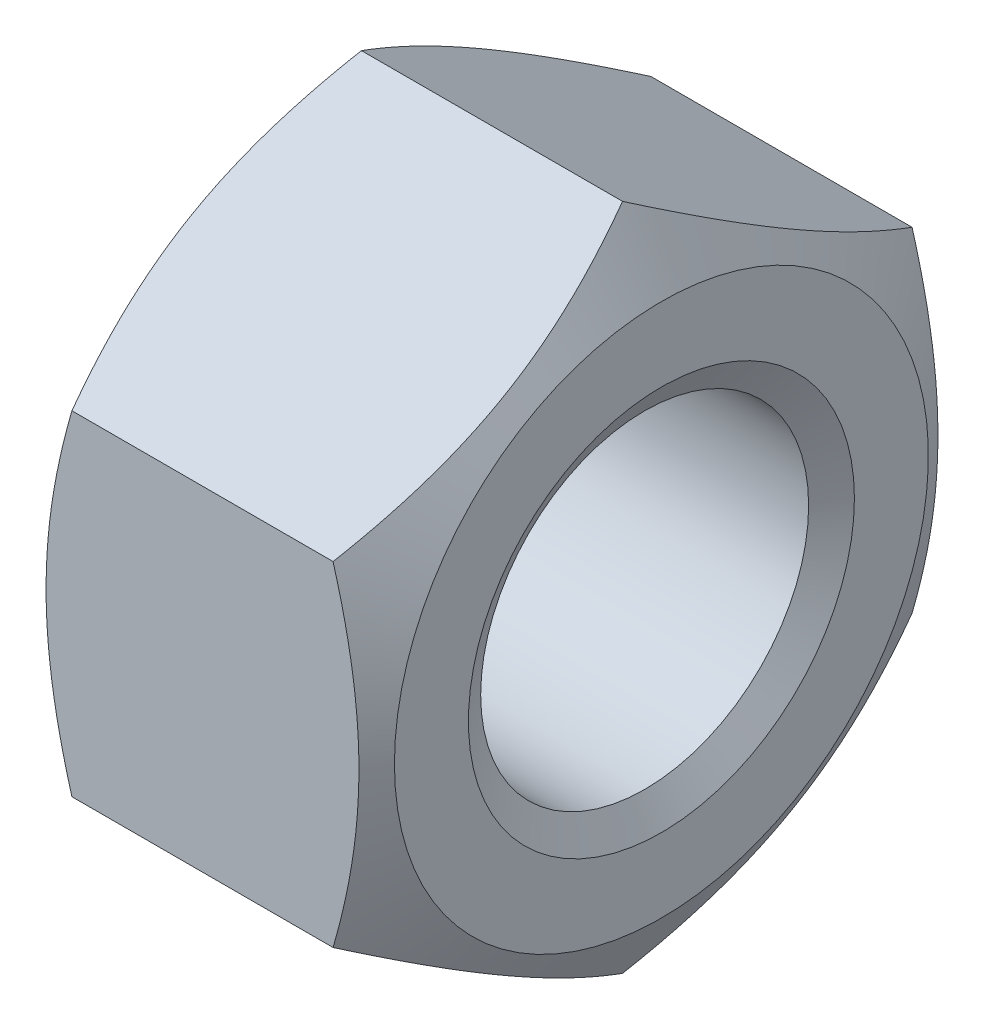
ISO-10303-21;
HEADER;
FILE_DESCRIPTION(('STEP AP214'),'2;1');
FILE_NAME('part.step','',(''),(''),'','','');
FILE_SCHEMA(('AUTOMOTIVE_DESIGN { 1 0 10303 214 1 1 1 1 }'));
ENDSEC;
DATA;
#1=APPLICATION_CONTEXT('core data for automotive mechanical design processes');
#2=APPLICATION_PROTOCOL_DEFINITION('international standard','automotive_design',2000,#1);
#3=PRODUCT_CONTEXT('',#1,'mechanical');
#4=PRODUCT('Part','Part','',(#3));
#5=PRODUCT_RELATED_PRODUCT_CATEGORY('part','',(#4));
#6=PRODUCT_DEFINITION_FORMATION('','',#4);
#7=PRODUCT_DEFINITION_CONTEXT('part definition',#1,'design');
#8=PRODUCT_DEFINITION('design','',#6,#7);
#9=PRODUCT_DEFINITION_SHAPE('','',#8);
#10=(LENGTH_UNIT() NAMED_UNIT(*) SI_UNIT(.MILLI.,.METRE.));
#11=(NAMED_UNIT(*) PLANE_ANGLE_UNIT() SI_UNIT($,.RADIAN.));
#12=(NAMED_UNIT(*) SI_UNIT($,.STERADIAN.) SOLID_ANGLE_UNIT());
#13=UNCERTAINTY_MEASURE_WITH_UNIT(LENGTH_MEASURE(1.E-05),#10,'distance_accuracy_value','');
#14=(GEOMETRIC_REPRESENTATION_CONTEXT(3) GLOBAL_UNCERTAINTY_ASSIGNED_CONTEXT((#13)) GLOBAL_UNIT_ASSIGNED_CONTEXT((#10,
#11,#12)) REPRESENTATION_CONTEXT('',''));
#15=CARTESIAN_POINT('',(0.,0.,0.));
#16=DIRECTION('',(0.,0.,1.));
#17=DIRECTION('',(1.,0.,0.));
#18=AXIS2_PLACEMENT_3D('',#15,#16,#17);
#19=CARTESIAN_POINT('',(0.,-7.79422863405995,13.5));
#20=DIRECTION('',(0.,0.,1.));
#21=DIRECTION('',(1.,0.,0.));
#22=AXIS2_PLACEMENT_3D('',#19,#20,#21);
#23=PLANE('',#22);
#24=CARTESIAN_POINT('',(13.9880108170991,7.79422866024235,13.4999999629604));
#25=CARTESIAN_POINT('',(14.0869101067593,7.45160224952271,13.4999999866953));
#26=CARTESIAN_POINT('',(14.1813213508545,7.10763941052336,13.4999999964342));
#27=CARTESIAN_POINT('',(14.3599202672367,6.41695557527496,13.5000000035669));
#28=CARTESIAN_POINT('',(14.4441045770286,6.07023371159992,13.5000000009567));
#29=CARTESIAN_POINT('',(14.6011179835783,5.37336182789301,13.499999999041));
#30=CARTESIAN_POINT('',(14.6739202156594,5.02320571029543,13.4999999997433));
#31=CARTESIAN_POINT('',(14.8066061822784,4.32046037851166,13.5000000002567));
#32=CARTESIAN_POINT('',(14.8664906537927,3.96787130431411,13.500000000068));
#33=CARTESIAN_POINT('',(14.9707940384127,3.26929452818138,13.4999999999337));
#34=CARTESIAN_POINT('',(15.0155581871121,2.92335868569997,13.4999999999822));
#35=CARTESIAN_POINT('',(15.0906168963567,2.22990195665751,13.5000000000178));
#36=CARTESIAN_POINT('',(15.1209111783586,1.88238103971397,13.5000000000048));
#37=CARTESIAN_POINT('',(15.166265243494,1.1867555101566,13.4999999999952));
#38=CARTESIAN_POINT('',(15.181343128927,0.838652085767659,13.4999999999987));
#39=CARTESIAN_POINT('',(15.1959401460983,0.142124020372473,13.5000000000013));
#40=CARTESIAN_POINT('',(15.1954597586715,-0.206300610373957,13.5000000000003));
#41=CARTESIAN_POINT('',(15.180027703548,-0.857664265109713,13.4999999999997));
#42=CARTESIAN_POINT('',(15.1669583745284,-1.16064973519983,13.4999999999999));
#43=CARTESIAN_POINT('',(15.1293010846734,-1.76592371877752,13.5000000000001));
#44=CARTESIAN_POINT('',(15.1047123092189,-2.06821218145541,13.5));
#45=CARTESIAN_POINT('',(15.0444448015208,-2.67192796651877,13.5));
#46=CARTESIAN_POINT('',(15.0087569114279,-2.97335436959429,13.5));
#47=CARTESIAN_POINT('',(14.9269172441516,-3.57479409811263,13.5));
#48=CARTESIAN_POINT('',(14.8807647556925,-3.87480732608679,13.5));
#49=CARTESIAN_POINT('',(14.7254437774325,-4.7855133357403,13.5));
#50=CARTESIAN_POINT('',(14.6007889254714,-5.39356902077825,13.5));
#51=CARTESIAN_POINT('',(14.3178743257524,-6.60061416271224,13.5));
#52=CARTESIAN_POINT('',(14.1596810103467,-7.19961907073027,13.5));
#53=CARTESIAN_POINT('',(13.9880108740801,-7.79422854685829,13.5));
#54=B_SPLINE_CURVE_WITH_KNOTS('',3,(#24,#25,#26,#27,#28,#29,#30,#31,#32,#33,#34,#35,#36,#37,#38,
#39,#40,#41,#42,#43,#44,#45,#46,#47,#48,#49,#50,#51,#52,#53),.UNSPECIFIED.,.F.,.F.,(4,2,2,2,2,2,
2,2,2,2,2,2,2,2,4),(0.,1.06987159776845,2.14009401005534,3.21280548552692,4.28545574510436,
5.33163116237121,6.37782671758112,7.42277618604716,8.46769335994359,9.37727574294967,
10.286922458478,11.1973217211974,12.1077828820422,13.9687405030041,15.8260458501166),.UNSPECIFIED.);
#55=CARTESIAN_POINT('',(13.9880108615043,7.79422865587877,13.4999999622087));
#56=VERTEX_POINT('',#55);
#57=CARTESIAN_POINT('',(13.9880108615043,-7.79422859042231,13.5));
#58=VERTEX_POINT('',#57);
#59=EDGE_CURVE('E93',#56,#58,#54,.T.);
#60=ORIENTED_EDGE('',*,*,#59,.F.);
#61=DIRECTION('',(1.,0.,0.));
#62=VECTOR('',#61,1.);
#63=CARTESIAN_POINT('',(0.,7.79422863405994,13.5));
#64=LINE('',#63,#62);
#65=CARTESIAN_POINT('',(1.8119891384957,7.7942285904223,13.5));
#66=VERTEX_POINT('',#65);
#67=EDGE_CURVE('E81',#66,#56,#64,.T.);
#68=ORIENTED_EDGE('',*,*,#67,.F.);
#69=CARTESIAN_POINT('',(1.81198912561879,-7.79422854686542,13.500000000463));
#70=CARTESIAN_POINT('',(1.71308985229794,-7.45160213430493,13.5000000001663));
#71=CARTESIAN_POINT('',(1.61867861594952,-7.10763929583323,13.5000000000446));
#72=CARTESIAN_POINT('',(1.4400797074397,-6.41695546364648,13.4999999999554));
#73=CARTESIAN_POINT('',(1.35589539777403,-6.07023360250527,13.499999999988));
#74=CARTESIAN_POINT('',(1.19888199347092,-5.37336172328858,13.500000000012));
#75=CARTESIAN_POINT('',(1.12607976351741,-5.02320560764564,13.5000000000032));
#76=CARTESIAN_POINT('',(0.993393800551334,-4.32046027993857,13.4999999999968));
#77=CARTESIAN_POINT('',(0.933509330563812,-3.9678712078628,13.4999999999991));
#78=CARTESIAN_POINT('',(0.82920594899106,-3.26929443570327,13.5000000000008));
#79=CARTESIAN_POINT('',(0.784441801819853,-2.92335859507128,13.5000000000002));
#80=CARTESIAN_POINT('',(0.709383095497415,-2.22990186977403,13.4999999999998));
#81=CARTESIAN_POINT('',(0.679088814890541,-1.88238095472614,13.4999999999999));
#82=CARTESIAN_POINT('',(0.633734752427124,-1.18675542906523,13.5000000000001));
#83=CARTESIAN_POINT('',(0.618656868269169,-0.838652006677177,13.5));
#84=CARTESIAN_POINT('',(0.60405985347564,-0.142123945350782,13.5));
#85=CARTESIAN_POINT('',(0.604540242004641,0.206300683327735,13.5));
#86=CARTESIAN_POINT('',(0.619972298979994,0.857664333131881,13.5));
#87=CARTESIAN_POINT('',(0.633041628733476,1.16064980036442,13.5));
#88=CARTESIAN_POINT('',(0.670698919816643,1.76592377821084,13.5));
#89=CARTESIAN_POINT('',(0.695287695765376,2.06821223801505,13.5));
#90=CARTESIAN_POINT('',(0.755555204216084,2.67192801734991,13.5));
#91=CARTESIAN_POINT('',(0.791243094567766,2.97335441757055,13.5));
#92=CARTESIAN_POINT('',(0.87308276213432,3.57479414039116,13.5));
#93=CARTESIAN_POINT('',(0.919235250624787,3.87480736552248,13.5));
#94=CARTESIAN_POINT('',(1.07455622858459,4.78551336612989,13.5));
#95=CARTESIAN_POINT('',(1.19921107984878,5.39356904500594,13.5));
#96=CARTESIAN_POINT('',(1.48212567742134,6.60061417472291,13.5));
#97=CARTESIAN_POINT('',(1.64031899137585,7.19961907668625,13.5));
#98=CARTESIAN_POINT('',(1.81198912591985,7.79422854685829,13.5));
#99=B_SPLINE_CURVE_WITH_KNOTS('',3,(#69,#70,#71,#72,#73,#74,#75,#76,#77,#78,#79,#80,#81,#82,#83,
#84,#85,#86,#87,#88,#89,#90,#91,#92,#93,#94,#95,#96,#97,#98),.UNSPECIFIED.,.F.,.F.,(4,2,2,2,2,2,
2,2,2,2,2,2,2,2,4),(0.,1.06987159010074,2.14009399505598,3.21280546340358,4.28545571597528,
5.33163112714016,6.37782667632872,7.42277613863558,8.4676933063396,9.37727568088262,
10.2869223879455,11.1973216422575,12.107782794693,13.9687403971654,15.8260457256511),.UNSPECIFIED.);
#100=CARTESIAN_POINT('',(1.8119891558046,-7.79422862589889,13.5000000141354));
#101=VERTEX_POINT('',#100);
#102=EDGE_CURVE('E251',#101,#66,#99,.T.);
#103=ORIENTED_EDGE('',*,*,#102,.F.);
#104=DIRECTION('',(1.,0.,0.));
#105=VECTOR('',#104,1.);
#106=CARTESIAN_POINT('',(0.,-7.79422863405995,13.5));
#107=LINE('',#106,#105);
#108=EDGE_CURVE('E96',#58,#101,#107,.F.);
#109=ORIENTED_EDGE('',*,*,#108,.F.);
#110=EDGE_LOOP('',(#60,#68,#103,#109));
#111=FACE_BOUND('',#110,.T.);
#112=ADVANCED_FACE('F17',(#111),#23,.T.);
#113=CARTESIAN_POINT('',(0.,7.79422863405994,13.5));
#114=DIRECTION('',(0.,0.866025403784438,0.5));
#115=DIRECTION('',(0.,-0.5,0.866025403784438));
#116=AXIS2_PLACEMENT_3D('',#113,#114,#115);
#117=PLANE('',#116);
#118=CARTESIAN_POINT('',(13.9880108743808,15.5884572249238,7.57432768256929E-08));
#119=CARTESIAN_POINT('',(14.0869101477017,15.4171440183868,0.296723252879927));
#120=CARTESIAN_POINT('',(14.1813213840502,15.2451625990456,0.594603808893396));
#121=CARTESIAN_POINT('',(14.3599202925601,14.899820682875,1.19275355350579));
#122=CARTESIAN_POINT('',(14.4441046022258,14.7264597523326,1.49302349331781));
#123=CARTESIAN_POINT('',(14.6011180065289,14.378023812745,2.09653224391446));
#124=CARTESIAN_POINT('',(14.6739202364824,14.2029457549159,2.39977633534736));
#125=CARTESIAN_POINT('',(14.8066061994485,13.8515730910568,3.00837164152931));
#126=CARTESIAN_POINT('',(14.8664906694361,13.675278555021,3.31372273504491));
#127=CARTESIAN_POINT('',(14.9707940510088,13.3259901689426,3.91870796622966));
#128=CARTESIAN_POINT('',(15.0155581981801,13.1530222486261,4.21829719229619));
#129=CARTESIAN_POINT('',(15.0906169045025,12.8062938859771,4.81884833282858));
#130=CARTESIAN_POINT('',(15.1209111851094,12.6325334284533,5.11981027360657));
#131=CARTESIAN_POINT('',(15.1662652475728,12.2847206656229,5.7222396503499));
#132=CARTESIAN_POINT('',(15.1813431317308,12.1106689544288,6.02370605728225));
#133=CARTESIAN_POINT('',(15.1959401465244,11.7624049237656,6.62691705283965));
#134=CARTESIAN_POINT('',(15.1954597579954,11.5881926094263,6.92866163257942));
#135=CARTESIAN_POINT('',(15.18002770102,11.2625107845242,7.4927591004116));
#136=CARTESIAN_POINT('',(15.1669583712665,11.111018050908,7.75515221201249));
#137=CARTESIAN_POINT('',(15.1293010801834,10.8083810619847,8.27933485307719));
#138=CARTESIAN_POINT('',(15.1047123042347,10.6572368320826,8.54112433853853));
#139=CARTESIAN_POINT('',(15.044444795784,10.3553789424152,9.06395754010808));
#140=CARTESIAN_POINT('',(15.0087569054323,10.2046657423048,9.32500046007046));
#141=CARTESIAN_POINT('',(14.9269172378657,9.9039458808945,9.84586253887822));
#142=CARTESIAN_POINT('',(14.8807647493753,9.75393926832883,10.1056816133133));
#143=CARTESIAN_POINT('',(14.7254437714155,9.29858626802509,10.8943761452183));
#144=CARTESIAN_POINT('',(14.6007889201513,8.99455842858704,11.4209678100404));
#145=CARTESIAN_POINT('',(14.3178743225787,8.39103586372851,12.4662995558896));
#146=CARTESIAN_POINT('',(14.1596810086242,8.09153341274682,12.9850530179813));
#147=CARTESIAN_POINT('',(13.9880108740801,7.79422867766077,13.4999999244811));
#148=B_SPLINE_CURVE_WITH_KNOTS('',3,(#118,#119,#120,#121,#122,#123,#124,#125,#126,#127,#128,
#129,#130,#131,#132,#133,#134,#135,#136,#137,#138,#139,#140,#141,#142,#143,#144,#145,#146,#147),
.UNSPECIFIED.,.F.,.F.,(4,2,2,2,2,2,2,2,2,2,2,2,2,2,4),(0.,1.06987159010081,2.1400939950561,
3.21280546340375,4.2854557159755,5.33163112714043,6.37782667632904,7.42277613863594,
8.46769330634001,9.3772756808831,10.286922387946,11.1973216422581,12.1077827946937,
13.9687403971662,15.8260457256521),.UNSPECIFIED.);
#149=CARTESIAN_POINT('',(13.9880108441955,15.5884572762807,1.41349774095088E-08));
#150=VERTEX_POINT('',#149);
#151=EDGE_CURVE('E21',#150,#56,#148,.T.);
#152=ORIENTED_EDGE('',*,*,#151,.F.);
#153=DIRECTION('',(1.,0.,0.));
#154=VECTOR('',#153,1.);
#155=CARTESIAN_POINT('',(0.,15.5884572681199,0.));
#156=LINE('',#155,#154);
#157=CARTESIAN_POINT('',(1.81198913849583,15.5884572463013,3.77909104283711E-08));
#158=VERTEX_POINT('',#157);
#159=EDGE_CURVE('E74',#158,#150,#156,.T.);
#160=ORIENTED_EDGE('',*,*,#159,.F.);
#161=CARTESIAN_POINT('',(1.81198918290087,7.79422858889149,13.5000000041548));
#162=CARTESIAN_POINT('',(1.71308989324074,7.96554181480638,13.2032768403316));
#163=CARTESIAN_POINT('',(1.61867864914546,8.13752324274019,12.9053962886698));
#164=CARTESIAN_POINT('',(1.44007973276333,8.4828651665415,12.3072465449278));
#165=CARTESIAN_POINT('',(1.35589542297144,8.65622609611851,12.0069766016326));
#166=CARTESIAN_POINT('',(1.19888201642165,9.00466203631293,11.4034678462014));
#167=CARTESIAN_POINT('',(1.12607978434056,9.17974009571987,11.1002237534225));
#168=CARTESIAN_POINT('',(0.993393817721581,9.53111276205641,10.4916284439636));
#169=CARTESIAN_POINT('',(0.93350934620728,9.70740729899175,10.1862773485173));
#170=CARTESIAN_POINT('',(0.82920596158729,10.0566956869418,9.58129211382538));
#171=CARTESIAN_POINT('',(0.784441812887876,10.2296636082245,9.28170288618117));
#172=CARTESIAN_POINT('',(0.709383103643322,10.5763919727766,8.68115174242291));
#173=CARTESIAN_POINT('',(0.679088821641425,10.7501524312371,8.38018979999684));
#174=CARTESIAN_POINT('',(0.633734756506004,11.0979651960075,7.7777604198744));
#175=CARTESIAN_POINT('',(0.618656871073031,11.272016908205,7.47629401121096));
#176=CARTESIAN_POINT('',(0.604059853901729,11.6202809409048,6.87308301213117));
#177=CARTESIAN_POINT('',(0.60454024132847,11.7944932562772,6.57133843060007));
#178=CARTESIAN_POINT('',(0.619972296451974,12.1201750836446,6.0072409584967));
#179=CARTESIAN_POINT('',(0.633041625471605,12.2716678186898,5.74484784442116));
#180=CARTESIAN_POINT('',(0.670698915326607,12.5743048104788,5.22066519839309));
#181=CARTESIAN_POINT('',(0.695287690781066,12.7254490418177,4.95887571044303));
#182=CARTESIAN_POINT('',(0.755555198479271,13.0273069343494,4.43604250391241));
#183=CARTESIAN_POINT('',(0.79124308857213,13.1780201358872,4.17499958147762));
#184=CARTESIAN_POINT('',(0.873082755848483,13.4787400001464,3.65413749773546));
#185=CARTESIAN_POINT('',(0.919235244307603,13.6287466141335,3.39431842083844));
#186=CARTESIAN_POINT('',(1.07455622256763,14.0840996189603,2.60562388109924));
#187=CARTESIAN_POINT('',(1.19921107452877,14.3881274614793,2.07903221094077));
#188=CARTESIAN_POINT('',(1.48212567424779,14.9916500324464,1.03370045451121));
#189=CARTESIAN_POINT('',(1.6403189896535,15.2911524864555,0.514946987175974));
#190=CARTESIAN_POINT('',(1.81198912592011,15.5884572245195,7.55180867993217E-08));
#191=B_SPLINE_CURVE_WITH_KNOTS('',3,(#161,#162,#163,#164,#165,#166,#167,#168,#169,#170,#171,
#172,#173,#174,#175,#176,#177,#178,#179,#180,#181,#182,#183,#184,#185,#186,#187,#188,#189,#190),
.UNSPECIFIED.,.F.,.F.,(4,2,2,2,2,2,2,2,2,2,2,2,2,2,4),(0.,1.06987159776845,2.14009401005534,
3.21280548552692,4.28545574510436,5.33163116237121,6.37782671758112,7.42277618604716,
8.46769335994359,9.37727574294978,10.2869224584782,11.1973217211977,12.1077828820426,
13.9687405030048,15.8260458501175),.UNSPECIFIED.);
#192=EDGE_CURVE('E84',#66,#158,#191,.T.);
#193=ORIENTED_EDGE('',*,*,#192,.F.);
#194=ORIENTED_EDGE('',*,*,#67,.T.);
#195=EDGE_LOOP('',(#152,#160,#193,#194));
#196=FACE_BOUND('',#195,.T.);
#197=ADVANCED_FACE('F83',(#196),#117,.T.);
#198=CARTESIAN_POINT('',(0.,15.5884572681199,0.));
#199=DIRECTION('',(0.,0.866025403784439,-0.499999999999999));
#200=DIRECTION('',(0.,0.499999999999999,0.866025403784439));
#201=AXIS2_PLACEMENT_3D('',#198,#199,#200);
#202=PLANE('',#201);
#203=CARTESIAN_POINT('',(13.9880108170991,7.79422858889153,-13.5000000041548));
#204=CARTESIAN_POINT('',(14.0869101067646,7.96554181481566,-13.2032768403156));
#205=CARTESIAN_POINT('',(14.1813213508647,8.13752324275878,-12.9053962886376));
#206=CARTESIAN_POINT('',(14.3599202672554,8.48286516657885,-12.3072465448631));
#207=CARTESIAN_POINT('',(14.4441045770509,8.6562260961653,-12.0069766015516));
#208=CARTESIAN_POINT('',(14.6011179836072,9.00466203637996,-11.4034678460854));
#209=CARTESIAN_POINT('',(14.6739202156911,9.1797400957977,-11.1002237532878));
#210=CARTESIAN_POINT('',(14.8066061823137,9.53111276215597,-10.4916284437912));
#211=CARTESIAN_POINT('',(14.866490653829,9.70740729910224,-10.186277348326));
#212=CARTESIAN_POINT('',(14.9707940384429,10.0566956870539,-9.58129211363129));
#213=CARTESIAN_POINT('',(15.0155581871369,10.2296636083272,-9.28170288600347));
#214=CARTESIAN_POINT('',(15.0906168963721,10.57639197286,-8.68115174227843));
#215=CARTESIAN_POINT('',(15.1209111783701,10.7501524313108,-8.38018979986919));
#216=CARTESIAN_POINT('',(15.166265243499,11.0979651960607,-7.77776041978232));
#217=CARTESIAN_POINT('',(15.1813431289296,11.2720169082474,-7.47629401113762));
#218=CARTESIAN_POINT('',(15.1959401460982,11.6202809409257,-6.87308301209496));
#219=CARTESIAN_POINT('',(15.1954597586711,11.7944932562875,-6.57133843058226));
#220=CARTESIAN_POINT('',(15.1800277034339,12.1201750860505,-6.00724095432949));
#221=CARTESIAN_POINT('',(15.1669583741132,12.2716678234996,-5.74484783609031));
#222=CARTESIAN_POINT('',(15.1293010832952,12.5743048200822,-5.22066518175962));
#223=CARTESIAN_POINT('',(15.1047123071788,12.7254490538107,-4.95887568967058));
#224=CARTESIAN_POINT('',(15.0444447978205,13.0273069511062,-4.4360424748888));
#225=CARTESIAN_POINT('',(15.0087569067287,13.1780201550181,-4.1749995483419));
#226=CARTESIAN_POINT('',(14.9269172371532,13.4787400239965,-3.65413745642585));
#227=CARTESIAN_POINT('',(14.8807647473939,13.6287466403287,-3.39431837546704));
#228=CARTESIAN_POINT('',(14.7254437647316,14.0840996523838,-2.60562382320814));
#229=CARTESIAN_POINT('',(14.6007889092357,14.388127499732,-2.07903214468519));
#230=CARTESIAN_POINT('',(14.3178743016784,14.9916500801818,-1.03370037183101));
#231=CARTESIAN_POINT('',(14.1596809819738,15.2911525388451,-0.514946896434516));
#232=CARTESIAN_POINT('',(13.9880108411845,15.588457281496,2.31681216030125E-08));
#233=B_SPLINE_CURVE_WITH_KNOTS('',3,(#203,#204,#205,#206,#207,#208,#209,#210,#211,#212,#213,
#214,#215,#216,#217,#218,#219,#220,#221,#222,#223,#224,#225,#226,#227,#228,#229,#230,#231,#232),
.UNSPECIFIED.,.F.,.F.,(4,2,2,2,2,2,2,2,2,2,2,2,2,2,4),(0.,1.06987159782616,2.14009401017068,
3.21280548570736,4.28545574534987,5.33163116255837,6.37782671770927,7.42277618610998,
8.46769335994361,9.37727575738742,10.2869224873578,11.1973217645671,12.1077829399049,
13.9687405913427,15.8260459686989),.UNSPECIFIED.);
#234=CARTESIAN_POINT('',(13.9880108615043,7.79422859042234,-13.5));
#235=VERTEX_POINT('',#234);
#236=EDGE_CURVE('E95',#235,#150,#233,.T.);
#237=ORIENTED_EDGE('',*,*,#236,.F.);
#238=DIRECTION('',(-1.,0.,0.));
#239=VECTOR('',#238,1.);
#240=CARTESIAN_POINT('',(0.,7.79422863405999,-13.5));
#241=LINE('',#240,#239);
#242=CARTESIAN_POINT('',(1.81198913849571,7.79422865587881,-13.4999999622087));
#243=VERTEX_POINT('',#242);
#244=EDGE_CURVE('E235',#243,#235,#241,.F.);
#245=ORIENTED_EDGE('',*,*,#244,.F.);
#246=CARTESIAN_POINT('',(1.81198918290043,15.5884572491337,4.11935399740381E-08));
#247=CARTESIAN_POINT('',(1.71308989324043,15.4171440643287,-0.296723146364551));
#248=CARTESIAN_POINT('',(1.61867864914521,15.2451626532631,-0.594603707765211));
#249=CARTESIAN_POINT('',(1.44007973276314,14.899820741816,-1.1927534586399));
#250=CARTESIAN_POINT('',(1.35589542297125,14.726459807718,-1.49302339932486));
#251=CARTESIAN_POINT('',(1.19888201642148,14.3780238642056,-2.09653215284029));
#252=CARTESIAN_POINT('',(1.1260797843404,14.2029458060149,-2.39977624632142));
#253=CARTESIAN_POINT('',(0.993393817721455,13.8515731405677,-3.00837155629378));
#254=CARTESIAN_POINT('',(0.933509346207165,13.6752786033055,-3.31372265155133));
#255=CARTESIAN_POINT('',(0.829205961587199,13.3259902151228,-3.91870788610893));
#256=CARTESIAN_POINT('',(0.784441812887797,13.1530222939242,-4.21829711380166));
#257=CARTESIAN_POINT('',(0.709383103643266,12.8062939294337,-4.81884825759543));
#258=CARTESIAN_POINT('',(0.67908882164138,12.6325334709507,-5.11981020000848));
#259=CARTESIAN_POINT('',(0.63373475650598,12.2847207061638,-5.72223958012139));
#260=CARTESIAN_POINT('',(0.618656871073018,12.1106689939724,-6.0237059887883));
#261=CARTESIAN_POINT('',(0.604059853901735,11.762404961277,-6.6269169878706));
#262=CARTESIAN_POINT('',(0.604540241328483,11.5881926459029,-6.92866156940073));
#263=CARTESIAN_POINT('',(0.619972296452001,11.2625108185346,-7.49275904150344));
#264=CARTESIAN_POINT('',(0.633041625471636,11.1110180834897,-7.75515215557914));
#265=CARTESIAN_POINT('',(0.67069891532664,10.808381091701,-8.27933480160725));
#266=CARTESIAN_POINT('',(0.695287690781098,10.657236860362,-8.54112428955721));
#267=CARTESIAN_POINT('',(0.755555198479296,10.3553789678303,-9.06395749608768));
#268=CARTESIAN_POINT('',(0.791243088572149,10.2046657662926,-9.32500041852244));
#269=CARTESIAN_POINT('',(0.873082755848485,9.90394590203347,-9.8458625022645));
#270=CARTESIAN_POINT('',(0.919235244307595,9.7539392880464,-10.1056815791615));
#271=CARTESIAN_POINT('',(1.07455622256758,9.29858628321968,-10.8943761189005));
#272=CARTESIAN_POINT('',(1.19921107452869,8.99455844070073,-11.4209677890589));
#273=CARTESIAN_POINT('',(1.48212567424763,8.39103586973379,-12.4662995454882));
#274=CARTESIAN_POINT('',(1.6403189896533,8.0915334157248,-12.9850530128234));
#275=CARTESIAN_POINT('',(1.81198912591986,7.79422867766081,-13.4999999244811));
#276=B_SPLINE_CURVE_WITH_KNOTS('',3,(#246,#247,#248,#249,#250,#251,#252,#253,#254,#255,#256,
#257,#258,#259,#260,#261,#262,#263,#264,#265,#266,#267,#268,#269,#270,#271,#272,#273,#274,#275),
.UNSPECIFIED.,.F.,.F.,(4,2,2,2,2,2,2,2,2,2,2,2,2,2,4),(0.,1.06987159776839,2.14009401005523,
3.21280548552675,4.28545574510414,5.33163116237093,6.37782671758079,7.42277618604679,
8.46769335994318,9.37727574294918,10.2869224584774,11.1973217211967,12.1077828820415,
13.9687405030033,15.8260458501156),.UNSPECIFIED.);
#277=EDGE_CURVE('E171',#158,#243,#276,.T.);
#278=ORIENTED_EDGE('',*,*,#277,.F.);
#279=ORIENTED_EDGE('',*,*,#159,.T.);
#280=EDGE_LOOP('',(#237,#245,#278,#279));
#281=FACE_BOUND('',#280,.T.);
#282=ADVANCED_FACE('F181',(#281),#202,.T.);
#283=CARTESIAN_POINT('',(0.,7.79422863405997,-13.5));
#284=DIRECTION('',(0.,0.,-1.));
#285=DIRECTION('',(-1.,0.,0.));
#286=AXIS2_PLACEMENT_3D('',#283,#284,#285);
#287=PLANE('',#286);
#288=CARTESIAN_POINT('',(13.9880108170991,-7.7942286602423,-13.4999999629604));
#289=CARTESIAN_POINT('',(14.0869101067593,-7.45160224952266,-13.4999999866953));
#290=CARTESIAN_POINT('',(14.1813213508546,-7.1076394105233,-13.4999999964342));
#291=CARTESIAN_POINT('',(14.3599202672367,-6.41695557527491,-13.5000000035669));
#292=CARTESIAN_POINT('',(14.4441045770286,-6.07023371159988,-13.5000000009567));
#293=CARTESIAN_POINT('',(14.6011179835784,-5.37336182789296,-13.499999999041));
#294=CARTESIAN_POINT('',(14.6739202156594,-5.02320571029538,-13.4999999997433));
#295=CARTESIAN_POINT('',(14.8066061822784,-4.32046037851162,-13.5000000002567));
#296=CARTESIAN_POINT('',(14.8664906537927,-3.96787130431406,-13.500000000068));
#297=CARTESIAN_POINT('',(14.9707940384127,-3.26929452818134,-13.4999999999337));
#298=CARTESIAN_POINT('',(15.0155581871121,-2.92335868569993,-13.4999999999822));
#299=CARTESIAN_POINT('',(15.0906168963567,-2.22990195665747,-13.5000000000178));
#300=CARTESIAN_POINT('',(15.1209111783586,-1.88238103971393,-13.5000000000048));
#301=CARTESIAN_POINT('',(15.166265243494,-1.18675551015656,-13.4999999999952));
#302=CARTESIAN_POINT('',(15.181343128927,-0.838652085767621,-13.4999999999987));
#303=CARTESIAN_POINT('',(15.1959401460983,-0.142124020372437,-13.5000000000013));
#304=CARTESIAN_POINT('',(15.1954597586715,0.206300610373992,-13.5000000000003));
#305=CARTESIAN_POINT('',(15.180027703548,0.857664265109747,-13.4999999999997));
#306=CARTESIAN_POINT('',(15.1669583745284,1.16064973519987,-13.4999999999999));
#307=CARTESIAN_POINT('',(15.1293010846734,1.76592371877755,-13.5000000000001));
#308=CARTESIAN_POINT('',(15.1047123092189,2.06821218145544,-13.5));
#309=CARTESIAN_POINT('',(15.0444448015208,2.6719279665188,-13.5));
#310=CARTESIAN_POINT('',(15.0087569114279,2.97335436959432,-13.5));
#311=CARTESIAN_POINT('',(14.9269172441516,3.57479409811266,-13.5));
#312=CARTESIAN_POINT('',(14.8807647556925,3.87480732608682,-13.5));
#313=CARTESIAN_POINT('',(14.7254437774325,4.78551333574033,-13.5));
#314=CARTESIAN_POINT('',(14.6007889254713,5.39356902077828,-13.5));
#315=CARTESIAN_POINT('',(14.3178743257524,6.60061416271227,-13.5));
#316=CARTESIAN_POINT('',(14.1596810103467,7.19961907073029,-13.5));
#317=CARTESIAN_POINT('',(13.9880108740801,7.79422854685832,-13.5));
#318=B_SPLINE_CURVE_WITH_KNOTS('',3,(#288,#289,#290,#291,#292,#293,#294,#295,#296,#297,#298,
#299,#300,#301,#302,#303,#304,#305,#306,#307,#308,#309,#310,#311,#312,#313,#314,#315,#316,#317),
.UNSPECIFIED.,.F.,.F.,(4,2,2,2,2,2,2,2,2,2,2,2,2,2,4),(0.,1.06987159776844,2.14009401005534,
3.21280548552691,4.28545574510435,5.33163116237119,6.3778267175811,7.42277618604714,
8.46769335994357,9.37727574294965,10.286922458478,11.1973217211973,12.1077828820422,
13.9687405030041,15.8260458501165),.UNSPECIFIED.);
#319=CARTESIAN_POINT('',(13.9880108615043,-7.79422865587873,-13.4999999622087));
#320=VERTEX_POINT('',#319);
#321=EDGE_CURVE('E134',#320,#235,#318,.T.);
#322=ORIENTED_EDGE('',*,*,#321,.F.);
#323=DIRECTION('',(1.,0.,0.));
#324=VECTOR('',#323,1.);
#325=CARTESIAN_POINT('',(0.,-7.79422863405991,-13.5));
#326=LINE('',#325,#324);
#327=CARTESIAN_POINT('',(1.8119891384957,-7.79422859042226,-13.5));
#328=VERTEX_POINT('',#327);
#329=EDGE_CURVE('E237',#328,#320,#326,.T.);
#330=ORIENTED_EDGE('',*,*,#329,.F.);
#331=CARTESIAN_POINT('',(1.81198918290089,7.79422866024239,-13.4999999629604));
#332=CARTESIAN_POINT('',(1.71308989324076,7.45160224952274,-13.4999999866953));
#333=CARTESIAN_POINT('',(1.61867864914547,7.10763941052339,-13.4999999964342));
#334=CARTESIAN_POINT('',(1.44007973276334,6.416955575275,-13.5000000035669));
#335=CARTESIAN_POINT('',(1.35589542297145,6.07023371159996,-13.5000000009567));
#336=CARTESIAN_POINT('',(1.19888201642166,5.37336182789304,-13.499999999041));
#337=CARTESIAN_POINT('',(1.12607978434057,5.02320571029546,-13.4999999997433));
#338=CARTESIAN_POINT('',(0.99339381772159,4.32046037851169,-13.5000000002567));
#339=CARTESIAN_POINT('',(0.933509346207288,3.96787130431414,-13.500000000068));
#340=CARTESIAN_POINT('',(0.829205961587297,3.26929452818141,-13.4999999999337));
#341=CARTESIAN_POINT('',(0.784441812887883,2.9233586857,-13.4999999999822));
#342=CARTESIAN_POINT('',(0.709383103643328,2.22990195665755,-13.5000000000178));
#343=CARTESIAN_POINT('',(0.67908882164143,1.882381039714,-13.5000000000048));
#344=CARTESIAN_POINT('',(0.633734756506008,1.18675551015663,-13.4999999999952));
#345=CARTESIAN_POINT('',(0.618656871073035,0.838652085767688,-13.4999999999987));
#346=CARTESIAN_POINT('',(0.604059853901732,0.142124020372501,-13.5000000000013));
#347=CARTESIAN_POINT('',(0.604540241328471,-0.20630061037393,-13.5000000000003));
#348=CARTESIAN_POINT('',(0.619972296451974,-0.857664265109686,-13.4999999999997));
#349=CARTESIAN_POINT('',(0.633041625471602,-1.16064973519981,-13.4999999999999));
#350=CARTESIAN_POINT('',(0.670698915326596,-1.76592371877749,-13.5000000000001));
#351=CARTESIAN_POINT('',(0.69528769078105,-2.06821218145538,-13.5));
#352=CARTESIAN_POINT('',(0.75555519847924,-2.67192796651874,-13.5));
#353=CARTESIAN_POINT('',(0.79124308857209,-2.97335436959426,-13.5));
#354=CARTESIAN_POINT('',(0.873082755848424,-3.5747940981126,-13.5));
#355=CARTESIAN_POINT('',(0.919235244307534,-3.87480732608675,-13.5));
#356=CARTESIAN_POINT('',(1.07455622256752,-4.78551333574026,-13.5));
#357=CARTESIAN_POINT('',(1.19921107452864,-5.39356902077821,-13.5));
#358=CARTESIAN_POINT('',(1.48212567424759,-6.6006141627122,-13.5));
#359=CARTESIAN_POINT('',(1.64031898965327,-7.19961907073022,-13.5));
#360=CARTESIAN_POINT('',(1.81198912591984,-7.79422854685825,-13.5));
#361=B_SPLINE_CURVE_WITH_KNOTS('',3,(#331,#332,#333,#334,#335,#336,#337,#338,#339,#340,#341,
#342,#343,#344,#345,#346,#347,#348,#349,#350,#351,#352,#353,#354,#355,#356,#357,#358,#359,#360),
.UNSPECIFIED.,.F.,.F.,(4,2,2,2,2,2,2,2,2,2,2,2,2,2,4),(0.,1.06987159776845,2.14009401005535,
3.21280548552693,4.28545574510437,5.33163116237121,6.37782671758112,7.42277618604717,
8.4676933599436,9.37727574294968,10.286922458478,11.1973217211974,12.1077828820422,
13.9687405030041,15.8260458501165),.UNSPECIFIED.);
#362=EDGE_CURVE('E160',#243,#328,#361,.T.);
#363=ORIENTED_EDGE('',*,*,#362,.F.);
#364=ORIENTED_EDGE('',*,*,#244,.T.);
#365=EDGE_LOOP('',(#322,#330,#363,#364));
#366=FACE_BOUND('',#365,.T.);
#367=ADVANCED_FACE('F148',(#366),#287,.T.);
#368=CARTESIAN_POINT('',(0.,-7.79422863405991,-13.5));
#369=DIRECTION('',(0.,-0.866025403784438,-0.500000000000001));
#370=DIRECTION('',(0.,0.500000000000001,-0.866025403784438));
#371=AXIS2_PLACEMENT_3D('',#368,#369,#370);
#372=PLANE('',#371);
#373=CARTESIAN_POINT('',(13.9880108170991,-15.5884572491338,4.11944338572282E-08));
#374=CARTESIAN_POINT('',(14.0869101067592,-15.4171440643291,-0.296723146363738));
#375=CARTESIAN_POINT('',(14.1813213508545,-15.2451626532635,-0.594603707764439));
#376=CARTESIAN_POINT('',(14.3599202672367,-14.8998207418165,-1.19275345863918));
#377=CARTESIAN_POINT('',(14.4441045770286,-14.7264598077184,-1.49302339932414));
#378=CARTESIAN_POINT('',(14.6011179835783,-14.3780238642059,-2.09653215283959));
#379=CARTESIAN_POINT('',(14.6739202156594,-14.2029458060153,-2.39977624632074));
#380=CARTESIAN_POINT('',(14.8066061822784,-13.8515731405681,-3.00837155629313));
#381=CARTESIAN_POINT('',(14.8664906537927,-13.6752786033059,-3.31372265155069));
#382=CARTESIAN_POINT('',(14.9707940384127,-13.3259902151232,-3.91870788610831));
#383=CARTESIAN_POINT('',(15.0155581871121,-13.1530222939245,-4.21829711380106));
#384=CARTESIAN_POINT('',(15.0906168963567,-12.8062939294341,-4.81884825759485));
#385=CARTESIAN_POINT('',(15.1209111783586,-12.632533470951,-5.11981020000792));
#386=CARTESIAN_POINT('',(15.166265243494,-12.2847207061641,-5.72223958012085));
#387=CARTESIAN_POINT('',(15.181343128927,-12.1106689939726,-6.02370598878777));
#388=CARTESIAN_POINT('',(15.1959401460983,-11.7624049612772,-6.6269169878701));
#389=CARTESIAN_POINT('',(15.1954597586715,-11.5881926459032,-6.92866156940024));
#390=CARTESIAN_POINT('',(15.180027703548,-11.2625108185348,-7.49275904150299));
#391=CARTESIAN_POINT('',(15.1669583745284,-11.1110180834899,-7.75515215557871));
#392=CARTESIAN_POINT('',(15.1293010846734,-10.8083810917012,-8.27933480160687));
#393=CARTESIAN_POINT('',(15.104712309219,-10.6572368603622,-8.54112428955684));
#394=CARTESIAN_POINT('',(15.0444448015208,-10.3553789678305,-9.06395749608736));
#395=CARTESIAN_POINT('',(15.0087569114279,-10.2046657662928,-9.32500041852214));
#396=CARTESIAN_POINT('',(14.9269172441516,-9.90394590203359,-9.84586250226424));
#397=CARTESIAN_POINT('',(14.8807647556925,-9.75393928804651,-10.1056815791612));
#398=CARTESIAN_POINT('',(14.7254437774325,-9.29858628321974,-10.8943761189003));
#399=CARTESIAN_POINT('',(14.6007889254713,-8.99455844070077,-11.4209677890587));
#400=CARTESIAN_POINT('',(14.3178743257524,-8.39103586973377,-12.4662995454882));
#401=CARTESIAN_POINT('',(14.1596810103467,-8.09153341572476,-12.9850530128234));
#402=CARTESIAN_POINT('',(13.9880108740801,-7.79422867766074,-13.4999999244812));
#403=B_SPLINE_CURVE_WITH_KNOTS('',3,(#373,#374,#375,#376,#377,#378,#379,#380,#381,#382,#383,
#384,#385,#386,#387,#388,#389,#390,#391,#392,#393,#394,#395,#396,#397,#398,#399,#400,#401,#402),
.UNSPECIFIED.,.F.,.F.,(4,2,2,2,2,2,2,2,2,2,2,2,2,2,4),(0.,1.06987159776845,2.14009401005534,
3.21280548552692,4.28545574510436,5.33163116237121,6.37782671758112,7.42277618604716,
8.46769335994359,9.37727574294968,10.286922458478,11.1973217211974,12.1077828820422,
13.9687405030042,15.8260458501166),.UNSPECIFIED.);
#404=CARTESIAN_POINT('',(13.9880108615043,-15.5884572463011,3.77913116561995E-08));
#405=VERTEX_POINT('',#404);
#406=EDGE_CURVE('E99',#405,#320,#403,.T.);
#407=ORIENTED_EDGE('',*,*,#406,.F.);
#408=DIRECTION('',(1.,0.,0.));
#409=VECTOR('',#408,1.);
#410=CARTESIAN_POINT('',(0.,-15.5884572681199,0.));
#411=LINE('',#410,#409);
#412=CARTESIAN_POINT('',(1.8119891384957,-15.5884572463011,-3.77913164189036E-08));
#413=VERTEX_POINT('',#412);
#414=EDGE_CURVE('E239',#413,#405,#411,.T.);
#415=ORIENTED_EDGE('',*,*,#414,.F.);
#416=CARTESIAN_POINT('',(1.81198918290089,-7.79422858889145,-13.5000000041549));
#417=CARTESIAN_POINT('',(1.71308989324076,-7.96554181480635,-13.2032768403316));
#418=CARTESIAN_POINT('',(1.61867864914547,-8.13752324274015,-12.9053962886698));
#419=CARTESIAN_POINT('',(1.44007973276334,-8.48286516654147,-12.3072465449278));
#420=CARTESIAN_POINT('',(1.35589542297145,-8.65622609611848,-12.0069766016326));
#421=CARTESIAN_POINT('',(1.19888201642166,-9.0046620363129,-11.4034678462015));
#422=CARTESIAN_POINT('',(1.12607978434057,-9.17974009571984,-11.1002237534226));
#423=CARTESIAN_POINT('',(0.993393817721588,-9.53111276205638,-10.4916284439636));
#424=CARTESIAN_POINT('',(0.933509346207286,-9.70740729899172,-10.1862773485173));
#425=CARTESIAN_POINT('',(0.829205961587296,-10.0566956869418,-9.58129211382542));
#426=CARTESIAN_POINT('',(0.784441812887881,-10.2296636082245,-9.28170288618121));
#427=CARTESIAN_POINT('',(0.709383103643326,-10.5763919727765,-8.68115174242295));
#428=CARTESIAN_POINT('',(0.679088821641429,-10.750152431237,-8.38018979999688));
#429=CARTESIAN_POINT('',(0.633734756506006,-11.0979651960075,-7.77776041987444));
#430=CARTESIAN_POINT('',(0.618656871073033,-11.272016908205,-7.476294011211));
#431=CARTESIAN_POINT('',(0.60405985390173,-11.6202809409048,-6.87308301213121));
#432=CARTESIAN_POINT('',(0.604540241328469,-11.7944932562772,-6.57133843060011));
#433=CARTESIAN_POINT('',(0.619972296451972,-12.1201750836445,-6.00724095849677));
#434=CARTESIAN_POINT('',(0.633041625471601,-12.2716678186898,-5.74484784442126));
#435=CARTESIAN_POINT('',(0.670698915326595,-12.5743048104787,-5.22066519839325));
#436=CARTESIAN_POINT('',(0.695287690781048,-12.7254490418176,-4.95887571044322));
#437=CARTESIAN_POINT('',(0.755555198479239,-13.0273069343493,-4.43604250391267));
#438=CARTESIAN_POINT('',(0.79124308857209,-13.178020135887,-4.1749995814779));
#439=CARTESIAN_POINT('',(0.873082755848425,-13.4787400001462,-3.65413749773581));
#440=CARTESIAN_POINT('',(0.919235244307535,-13.6287466141333,-3.39431842083882));
#441=CARTESIAN_POINT('',(1.07455622256753,-14.0840996189601,-2.60562388109971));
#442=CARTESIAN_POINT('',(1.19921107452864,-14.388127461479,-2.0790322109413));
#443=CARTESIAN_POINT('',(1.4821256742476,-14.991650032446,-1.03370045451186));
#444=CARTESIAN_POINT('',(1.64031898965328,-15.2911524864551,-0.514946987176689));
#445=CARTESIAN_POINT('',(1.81198912591985,-15.5884572245191,-7.55188624634964E-08));
#446=B_SPLINE_CURVE_WITH_KNOTS('',3,(#416,#417,#418,#419,#420,#421,#422,#423,#424,#425,#426,
#427,#428,#429,#430,#431,#432,#433,#434,#435,#436,#437,#438,#439,#440,#441,#442,#443,#444,#445),
.UNSPECIFIED.,.F.,.F.,(4,2,2,2,2,2,2,2,2,2,2,2,2,2,4),(0.,1.06987159776845,2.14009401005535,
3.21280548552693,4.28545574510437,5.33163116237121,6.37782671758112,7.42277618604717,
8.4676933599436,9.37727574294968,10.286922458478,11.1973217211974,12.1077828820422,
13.9687405030042,15.8260458501166),.UNSPECIFIED.);
#447=EDGE_CURVE('E41',#328,#413,#446,.T.);
#448=ORIENTED_EDGE('',*,*,#447,.F.);
#449=ORIENTED_EDGE('',*,*,#329,.T.);
#450=EDGE_LOOP('',(#407,#415,#448,#449));
#451=FACE_BOUND('',#450,.T.);
#452=ADVANCED_FACE('F145',(#451),#372,.T.);
#453=CARTESIAN_POINT('',(0.,-15.5884572681199,0.));
#454=DIRECTION('',(0.,-0.866025403784439,0.5));
#455=DIRECTION('',(0.,-0.5,-0.866025403784439));
#456=AXIS2_PLACEMENT_3D('',#453,#454,#455);
#457=PLANE('',#456);
#458=CARTESIAN_POINT('',(13.9880108170991,-7.7942285888915,13.5000000041548));
#459=CARTESIAN_POINT('',(14.0869101067592,-7.9655418148064,13.2032768403316));
#460=CARTESIAN_POINT('',(14.1813213508545,-8.1375232427402,12.9053962886698));
#461=CARTESIAN_POINT('',(14.3599202672367,-8.48286516654152,12.3072465449278));
#462=CARTESIAN_POINT('',(14.4441045770286,-8.65622609611852,12.0069766016326));
#463=CARTESIAN_POINT('',(14.6011179835783,-9.00466203631294,11.4034678462014));
#464=CARTESIAN_POINT('',(14.6739202156594,-9.17974009571988,11.1002237534225));
#465=CARTESIAN_POINT('',(14.8066061822784,-9.53111276205642,10.4916284439636));
#466=CARTESIAN_POINT('',(14.8664906537927,-9.70740729899175,10.1862773485173));
#467=CARTESIAN_POINT('',(14.9707940384127,-10.0566956869418,9.58129211382538));
#468=CARTESIAN_POINT('',(15.0155581871121,-10.2296636082246,9.28170288618117));
#469=CARTESIAN_POINT('',(15.0906168963567,-10.5763919727766,8.68115174242291));
#470=CARTESIAN_POINT('',(15.1209111783586,-10.7501524312371,8.38018979999684));
#471=CARTESIAN_POINT('',(15.166265243494,-11.0979651960075,7.7777604198744));
#472=CARTESIAN_POINT('',(15.181343128927,-11.272016908205,7.47629401121096));
#473=CARTESIAN_POINT('',(15.1959401460983,-11.6202809409048,6.87308301213117));
#474=CARTESIAN_POINT('',(15.1954597586715,-11.7944932562772,6.57133843060007));
#475=CARTESIAN_POINT('',(15.180027703548,-12.1201750836445,6.00724095849673));
#476=CARTESIAN_POINT('',(15.1669583745284,-12.2716678186898,5.74484784442122));
#477=CARTESIAN_POINT('',(15.1293010846734,-12.5743048104788,5.22066519839321));
#478=CARTESIAN_POINT('',(15.1047123092189,-12.7254490418176,4.95887571044319));
#479=CARTESIAN_POINT('',(15.0444448015208,-13.0273069343493,4.43604250391263));
#480=CARTESIAN_POINT('',(15.0087569114279,-13.1780201358871,4.17499958147787));
#481=CARTESIAN_POINT('',(14.9269172441516,-13.4787400001462,3.65413749773578));
#482=CARTESIAN_POINT('',(14.8807647556925,-13.6287466141333,3.39431842083879));
#483=CARTESIAN_POINT('',(14.7254437774325,-14.0840996189601,2.60562388109969));
#484=CARTESIAN_POINT('',(14.6007889254714,-14.388127461479,2.07903221094128));
#485=CARTESIAN_POINT('',(14.3178743257524,-14.991650032446,1.03370045451185));
#486=CARTESIAN_POINT('',(14.1596810103467,-15.2911524864551,0.514946987176673));
#487=CARTESIAN_POINT('',(13.9880108740801,-15.5884572245191,7.55188485615225E-08));
#488=B_SPLINE_CURVE_WITH_KNOTS('',3,(#458,#459,#460,#461,#462,#463,#464,#465,#466,#467,#468,
#469,#470,#471,#472,#473,#474,#475,#476,#477,#478,#479,#480,#481,#482,#483,#484,#485,#486,#487),
.UNSPECIFIED.,.F.,.F.,(4,2,2,2,2,2,2,2,2,2,2,2,2,2,4),(0.,1.06987159776845,2.14009401005535,
3.21280548552692,4.28545574510436,5.33163116237121,6.37782671758111,7.42277618604716,
8.46769335994359,9.37727574294967,10.286922458478,11.1973217211974,12.1077828820422,
13.9687405030041,15.8260458501165),.UNSPECIFIED.);
#489=EDGE_CURVE('E98',#58,#405,#488,.T.);
#490=ORIENTED_EDGE('',*,*,#489,.F.);
#491=ORIENTED_EDGE('',*,*,#108,.T.);
#492=CARTESIAN_POINT('',(1.81198918290088,-15.5884572491338,-4.1194445329347E-08));
#493=CARTESIAN_POINT('',(1.71308989323542,-15.4171440643199,0.296723146379731));
#494=CARTESIAN_POINT('',(1.61867864913528,-15.245162653245,0.594603707796565));
#495=CARTESIAN_POINT('',(1.44007973274463,-14.8998207417792,1.19275345870379));
#496=CARTESIAN_POINT('',(1.35589542294907,-14.7264598076717,1.49302339940511));
#497=CARTESIAN_POINT('',(1.19888201639277,-14.378023864139,2.09653215295562));
#498=CARTESIAN_POINT('',(1.12607978430894,-14.2029458059375,2.39977624645548));
#499=CARTESIAN_POINT('',(0.993393817686249,-13.8515731404685,3.00837155646552));
#500=CARTESIAN_POINT('',(0.933509346170987,-13.6752786031954,3.31372265174201));
#501=CARTESIAN_POINT('',(0.829205961557063,-13.3259902150111,3.91870788630238));
#502=CARTESIAN_POINT('',(0.784441812863059,-13.1530222938219,4.21829711397874));
#503=CARTESIAN_POINT('',(0.709383103627881,-12.8062939293507,4.81884825773932));
#504=CARTESIAN_POINT('',(0.679088821629942,-12.6325334708773,5.11981020013555));
#505=CARTESIAN_POINT('',(0.63373475650095,-12.284720706111,5.72223958021291));
#506=CARTESIAN_POINT('',(0.618656871070359,-12.1106689939303,6.02370598886109));
#507=CARTESIAN_POINT('',(0.604059853901759,-11.7624049612564,6.62691698790628));
#508=CARTESIAN_POINT('',(0.604540241328858,-11.5881926458929,6.92866156941804));
#509=CARTESIAN_POINT('',(0.619972296566069,-11.2625108161289,7.49275904567024));
#510=CARTESIAN_POINT('',(0.633041625886841,-11.1110180786801,7.75515216390966));
#511=CARTESIAN_POINT('',(0.670698916704832,-10.8083810820978,8.27933481824057));
#512=CARTESIAN_POINT('',(0.695287692821207,-10.6572368483691,8.54112431032958));
#513=CARTESIAN_POINT('',(0.755555202179541,-10.3553789510735,9.06395752511138));
#514=CARTESIAN_POINT('',(0.791243093271327,-10.2046657471616,9.32500045165833));
#515=CARTESIAN_POINT('',(0.873082762846802,-9.90394587818314,9.84586254357446));
#516=CARTESIAN_POINT('',(0.919235252606159,-9.75393926185095,10.1056816245333));
#517=CARTESIAN_POINT('',(1.07455623526849,-9.29858624979582,10.8943761767923));
#518=CARTESIAN_POINT('',(1.19921109076442,-8.99455840244754,11.4209678553153));
#519=CARTESIAN_POINT('',(1.48212569832182,-8.39103582199764,12.4662996281696));
#520=CARTESIAN_POINT('',(1.64031901802643,-8.09153336333438,12.9850531035662));
#521=CARTESIAN_POINT('',(1.81198915881577,-7.79422862068339,13.5000000231689));
#522=B_SPLINE_CURVE_WITH_KNOTS('',3,(#492,#493,#494,#495,#496,#497,#498,#499,#500,#501,#502,
#503,#504,#505,#506,#507,#508,#509,#510,#511,#512,#513,#514,#515,#516,#517,#518,#519,#520,#521),
.UNSPECIFIED.,.F.,.F.,(4,2,2,2,2,2,2,2,2,2,2,2,2,2,4),(0.,1.06987159782616,2.14009401017068,
3.21280548570736,4.28545574534988,5.33163116255837,6.37782671770927,7.42277618610998,
8.46769335994361,9.37727575738753,10.2869224873581,11.1973217645675,12.1077829399054,
13.9687405913434,15.8260459686998),.UNSPECIFIED.);
#523=EDGE_CURVE('E159',#413,#101,#522,.T.);
#524=ORIENTED_EDGE('',*,*,#523,.F.);
#525=ORIENTED_EDGE('',*,*,#414,.T.);
#526=EDGE_LOOP('',(#490,#491,#524,#525));
#527=FACE_BOUND('',#526,.T.);
#528=ADVANCED_FACE('F115',(#527),#457,.T.);
#529=CARTESIAN_POINT('',(13.977138914619,0.,0.));
#530=DIRECTION('',(-1.,0.,0.));
#531=DIRECTION('',(0.,0.,1.));
#532=AXIS2_PLACEMENT_3D('',#529,#530,#531);
#533=CONICAL_SURFACE('',#532,15.6072880106315,1.04719755);
#534=CARTESIAN_POINT('',(15.8000000018777,0.,0.));
#535=DIRECTION('',(-1.,0.,0.));
#536=DIRECTION('',(0.,0.,1.));
#537=AXIS2_PLACEMENT_3D('',#534,#535,#536);
#538=CIRCLE('',#537,12.4500000010841);
#539=CARTESIAN_POINT('',(15.8000000018777,0.,12.4500000010841));
#540=VERTEX_POINT('',#539);
#541=EDGE_CURVE('E225',#540,#540,#538,.F.);
#542=ORIENTED_EDGE('',*,*,#541,.F.);
#543=EDGE_LOOP('',(#542));
#544=FACE_BOUND('',#543,.T.);
#545=ORIENTED_EDGE('',*,*,#321,.T.);
#546=ORIENTED_EDGE('',*,*,#236,.T.);
#547=ORIENTED_EDGE('',*,*,#151,.T.);
#548=ORIENTED_EDGE('',*,*,#59,.T.);
#549=ORIENTED_EDGE('',*,*,#489,.T.);
#550=ORIENTED_EDGE('',*,*,#406,.T.);
#551=EDGE_LOOP('',(#545,#546,#547,#548,#549,#550));
#552=FACE_BOUND('',#551,.T.);
#553=ADVANCED_FACE('F91',(#544,#552),#533,.T.);
#554=CARTESIAN_POINT('',(1.82286108538096,0.,0.));
#555=DIRECTION('',(1.,0.,0.));
#556=DIRECTION('',(0.,0.,-1.));
#557=AXIS2_PLACEMENT_3D('',#554,#555,#556);
#558=CONICAL_SURFACE('',#557,15.6072880106315,1.04719755);
#559=CARTESIAN_POINT('',(-1.87773494669807E-09,0.,0.));
#560=DIRECTION('',(1.,0.,0.));
#561=DIRECTION('',(0.,0.,-1.));
#562=AXIS2_PLACEMENT_3D('',#559,#560,#561);
#563=CIRCLE('',#562,12.4500000010841);
#564=CARTESIAN_POINT('',(-1.8777348602108E-09,0.,-12.4500000010841));
#565=VERTEX_POINT('',#564);
#566=EDGE_CURVE('E226',#565,#565,#563,.T.);
#567=ORIENTED_EDGE('',*,*,#566,.T.);
#568=EDGE_LOOP('',(#567));
#569=FACE_BOUND('',#568,.T.);
#570=ORIENTED_EDGE('',*,*,#447,.T.);
#571=ORIENTED_EDGE('',*,*,#523,.T.);
#572=ORIENTED_EDGE('',*,*,#102,.T.);
#573=ORIENTED_EDGE('',*,*,#192,.T.);
#574=ORIENTED_EDGE('',*,*,#277,.T.);
#575=ORIENTED_EDGE('',*,*,#362,.T.);
#576=EDGE_LOOP('',(#570,#571,#572,#573,#574,#575));
#577=FACE_BOUND('',#576,.T.);
#578=ADVANCED_FACE('F114',(#569,#577),#558,.T.);
#579=CARTESIAN_POINT('',(15.8,0.,0.));
#580=DIRECTION('',(1.,0.,0.));
#581=DIRECTION('',(0.,0.,-1.));
#582=AXIS2_PLACEMENT_3D('',#579,#580,#581);
#583=PLANE('',#582);
#584=CARTESIAN_POINT('',(15.8000000008096,0.,0.));
#585=DIRECTION('',(1.,0.,0.));
#586=DIRECTION('',(0.,0.,-1.));
#587=AXIS2_PLACEMENT_3D('',#584,#585,#586);
#588=CIRCLE('',#587,8.99999969294577);
#589=CARTESIAN_POINT('',(15.8000000008096,0.,-8.99999969294577));
#590=VERTEX_POINT('',#589);
#591=EDGE_CURVE('E222',#590,#590,#588,.F.);
#592=ORIENTED_EDGE('',*,*,#591,.T.);
#593=EDGE_LOOP('',(#592));
#594=FACE_BOUND('',#593,.T.);
#595=ORIENTED_EDGE('',*,*,#541,.T.);
#596=EDGE_LOOP('',(#595));
#597=FACE_BOUND('',#596,.T.);
#598=ADVANCED_FACE('F211',(#594,#597),#583,.T.);
#599=CARTESIAN_POINT('',(0.,0.,0.));
#600=DIRECTION('',(1.,0.,0.));
#601=DIRECTION('',(0.,0.,-1.));
#602=AXIS2_PLACEMENT_3D('',#599,#600,#601);
#603=PLANE('',#602);
#604=CARTESIAN_POINT('',(-8.09596693070874E-10,0.,0.));
#605=DIRECTION('',(-1.,0.,0.));
#606=DIRECTION('',(0.,0.,1.));
#607=AXIS2_PLACEMENT_3D('',#604,#605,#606);
#608=CIRCLE('',#607,8.99999969294577);
#609=CARTESIAN_POINT('',(-8.09596693070874E-10,0.,8.99999969294577));
#610=VERTEX_POINT('',#609);
#611=EDGE_CURVE('E231',#610,#610,#608,.F.);
#612=ORIENTED_EDGE('',*,*,#611,.T.);
#613=EDGE_LOOP('',(#612));
#614=FACE_BOUND('',#613,.T.);
#615=ORIENTED_EDGE('',*,*,#566,.F.);
#616=EDGE_LOOP('',(#615));
#617=FACE_BOUND('',#616,.T.);
#618=ADVANCED_FACE('F208',(#614,#617),#603,.F.);
#619=CARTESIAN_POINT('',(15.8000000008096,0.,0.));
#620=DIRECTION('',(1.,0.,0.));
#621=DIRECTION('',(0.,0.,-1.));
#622=AXIS2_PLACEMENT_3D('',#619,#620,#621);
#623=CONICAL_SURFACE('',#622,8.99999969294577,1.04719755);
#624=ORIENTED_EDGE('',*,*,#591,.F.);
#625=EDGE_LOOP('',(#624));
#626=FACE_BOUND('',#625,.T.);
#627=CARTESIAN_POINT('',(15.01875,0.,0.));
#628=DIRECTION('',(1.,0.,0.));
#629=DIRECTION('',(0.,0.,-1.));
#630=AXIS2_PLACEMENT_3D('',#627,#628,#629);
#631=CIRCLE('',#630,7.646835);
#632=CARTESIAN_POINT('',(15.01875,0.,-7.646835));
#633=VERTEX_POINT('',#632);
#634=EDGE_CURVE('E32',#633,#633,#631,.F.);
#635=ORIENTED_EDGE('',*,*,#634,.T.);
#636=EDGE_LOOP('',(#635));
#637=FACE_BOUND('',#636,.T.);
#638=ADVANCED_FACE('F200',(#626,#637),#623,.F.);
#639=CARTESIAN_POINT('',(-8.09596693070874E-10,0.,0.));
#640=DIRECTION('',(-1.,0.,0.));
#641=DIRECTION('',(0.,0.,1.));
#642=AXIS2_PLACEMENT_3D('',#639,#640,#641);
#643=CONICAL_SURFACE('',#642,8.99999969294577,1.04719755);
#644=ORIENTED_EDGE('',*,*,#611,.F.);
#645=EDGE_LOOP('',(#644));
#646=FACE_BOUND('',#645,.T.);
#647=CARTESIAN_POINT('',(0.781250000000001,0.,0.));
#648=DIRECTION('',(1.,0.,0.));
#649=DIRECTION('',(0.,0.,-1.));
#650=AXIS2_PLACEMENT_3D('',#647,#648,#649);
#651=CIRCLE('',#650,7.646835);
#652=CARTESIAN_POINT('',(0.781250000000001,0.,-7.646835));
#653=VERTEX_POINT('',#652);
#654=EDGE_CURVE('E11',#653,#653,#651,.T.);
#655=ORIENTED_EDGE('',*,*,#654,.T.);
#656=EDGE_LOOP('',(#655));
#657=FACE_BOUND('',#656,.T.);
#658=ADVANCED_FACE('F194',(#646,#657),#643,.F.);
#659=CARTESIAN_POINT('',(-28.6869610091877,0.,0.));
#660=DIRECTION('',(1.,0.,0.));
#661=DIRECTION('',(0.,0.,-1.));
#662=AXIS2_PLACEMENT_3D('',#659,#660,#661);
#663=CYLINDRICAL_SURFACE('',#662,7.646835);
#664=ORIENTED_EDGE('',*,*,#654,.F.);
#665=EDGE_LOOP('',(#664));
#666=FACE_BOUND('',#665,.T.);
#667=ORIENTED_EDGE('',*,*,#634,.F.);
#668=EDGE_LOOP('',(#667));
#669=FACE_BOUND('',#668,.T.);
#670=ADVANCED_FACE('F192',(#666,#669),#663,.F.);
#671=CLOSED_SHELL('',(#112,#197,#282,#367,#452,#528,#553,#578,#598,#618,#638,#658,#670));
#672=MANIFOLD_SOLID_BREP('B1',#671);
#673=ADVANCED_BREP_SHAPE_REPRESENTATION('',(#18,#672),#14);
#674=SHAPE_DEFINITION_REPRESENTATION(#9,#673);
ENDSEC;
END-ISO-10303-21;
